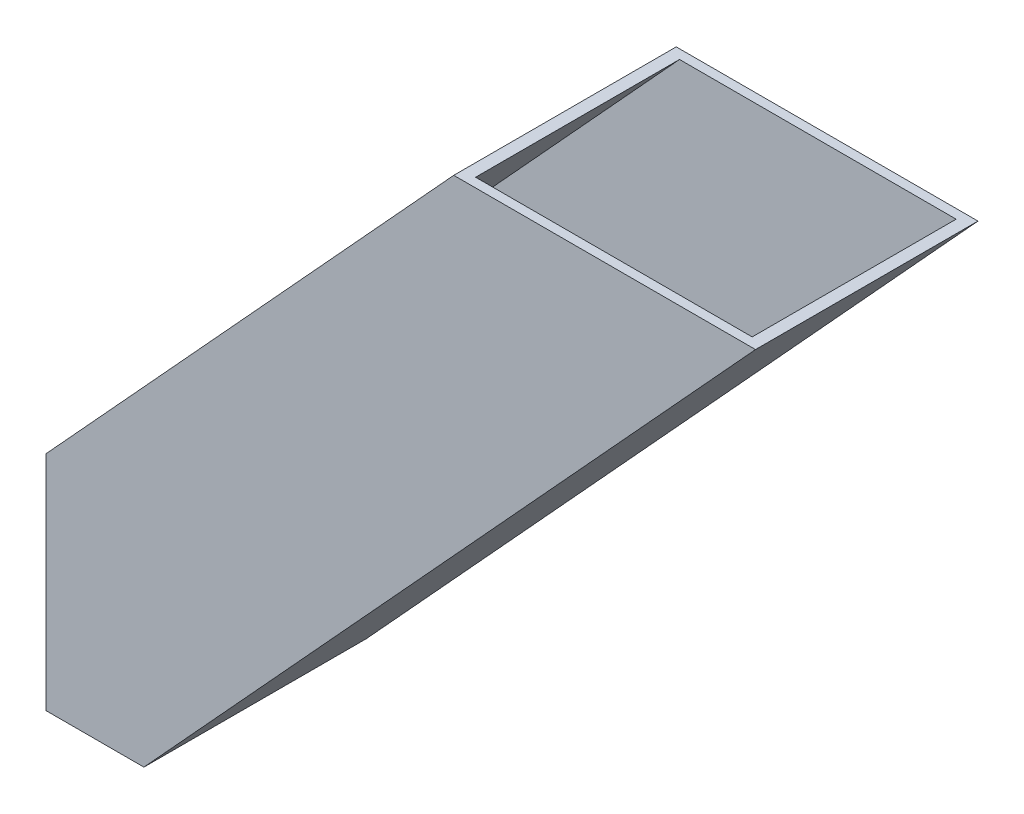
ISO-10303-21;
HEADER;
FILE_DESCRIPTION(('STEP AP214'),'2;1');
FILE_NAME('part.step','',(''),(''),'','','');
FILE_SCHEMA(('AUTOMOTIVE_DESIGN { 1 0 10303 214 1 1 1 1 }'));
ENDSEC;
DATA;
#1=APPLICATION_CONTEXT('core data for automotive mechanical design processes');
#2=APPLICATION_PROTOCOL_DEFINITION('international standard','automotive_design',2000,#1);
#3=PRODUCT_CONTEXT('',#1,'mechanical');
#4=PRODUCT('Part','Part','',(#3));
#5=PRODUCT_RELATED_PRODUCT_CATEGORY('part','',(#4));
#6=PRODUCT_DEFINITION_FORMATION('','',#4);
#7=PRODUCT_DEFINITION_CONTEXT('part definition',#1,'design');
#8=PRODUCT_DEFINITION('design','',#6,#7);
#9=PRODUCT_DEFINITION_SHAPE('','',#8);
#10=(LENGTH_UNIT() NAMED_UNIT(*) SI_UNIT(.MILLI.,.METRE.));
#11=(NAMED_UNIT(*) PLANE_ANGLE_UNIT() SI_UNIT($,.RADIAN.));
#12=(NAMED_UNIT(*) SI_UNIT($,.STERADIAN.) SOLID_ANGLE_UNIT());
#13=UNCERTAINTY_MEASURE_WITH_UNIT(LENGTH_MEASURE(1.E-05),#10,'distance_accuracy_value','');
#14=(GEOMETRIC_REPRESENTATION_CONTEXT(3) GLOBAL_UNCERTAINTY_ASSIGNED_CONTEXT((#13)) GLOBAL_UNIT_ASSIGNED_CONTEXT((#10,
#11,#12)) REPRESENTATION_CONTEXT('',''));
#15=CARTESIAN_POINT('',(0.,0.,0.));
#16=DIRECTION('',(0.,0.,1.));
#17=DIRECTION('',(1.,0.,0.));
#18=AXIS2_PLACEMENT_3D('',#15,#16,#17);
#19=CARTESIAN_POINT('',(0.,0.,38.1));
#20=DIRECTION('',(0.,0.,1.));
#21=DIRECTION('',(1.,0.,0.));
#22=AXIS2_PLACEMENT_3D('',#19,#20,#21);
#23=PLANE('',#22);
#24=DIRECTION('',(0.,1.,0.));
#25=VECTOR('',#24,1.);
#26=CARTESIAN_POINT('',(-93.4095887439773,0.,38.1));
#27=LINE('',#26,#25);
#28=CARTESIAN_POINT('',(-93.4095887439773,-121.744349357766,38.1));
#29=VERTEX_POINT('',#28);
#30=CARTESIAN_POINT('',(-93.4095887439773,-45.5443493577662,38.1));
#31=VERTEX_POINT('',#30);
#32=EDGE_CURVE('E205',#29,#31,#27,.T.);
#33=ORIENTED_EDGE('',*,*,#32,.F.);
#34=DIRECTION('',(1.,0.,0.));
#35=VECTOR('',#34,1.);
#36=CARTESIAN_POINT('',(0.,-121.744349357766,38.1));
#37=LINE('',#36,#35);
#38=CARTESIAN_POINT('',(-59.8805305963749,-121.744349357766,38.1));
#39=VERTEX_POINT('',#38);
#40=EDGE_CURVE('E140',#29,#39,#37,.T.);
#41=ORIENTED_EDGE('',*,*,#40,.T.);
#42=DIRECTION('',(-0.675586062236673,-0.737281135328679,0.));
#43=VECTOR('',#42,1.);
#44=CARTESIAN_POINT('',(28.0904112560227,-25.7398289712173,38.1));
#45=LINE('',#44,#43);
#46=CARTESIAN_POINT('',(149.590411256023,106.855650642234,38.1));
#47=VERTEX_POINT('',#46);
#48=EDGE_CURVE('E167',#47,#39,#45,.T.);
#49=ORIENTED_EDGE('',*,*,#48,.F.);
#50=DIRECTION('',(-1.,0.,0.));
#51=VECTOR('',#50,1.);
#52=CARTESIAN_POINT('',(0.,106.855650642234,38.1));
#53=LINE('',#52,#51);
#54=CARTESIAN_POINT('',(46.2377058242878,106.855650642234,38.1));
#55=VERTEX_POINT('',#54);
#56=EDGE_CURVE('E156',#47,#55,#53,.T.);
#57=ORIENTED_EDGE('',*,*,#56,.T.);
#58=DIRECTION('',(0.675586062236673,0.737281135328679,0.));
#59=VECTOR('',#58,1.);
#60=CARTESIAN_POINT('',(-28.0904112560227,25.7398289712172,38.1));
#61=LINE('',#60,#59);
#62=EDGE_CURVE('E155',#31,#55,#61,.T.);
#63=ORIENTED_EDGE('',*,*,#62,.F.);
#64=EDGE_LOOP('',(#33,#41,#49,#57,#63));
#65=FACE_BOUND('',#64,.T.);
#66=ADVANCED_FACE('F41',(#65),#23,.T.);
#67=CARTESIAN_POINT('',(0.,0.,-38.1));
#68=DIRECTION('',(0.,0.,1.));
#69=DIRECTION('',(1.,0.,0.));
#70=AXIS2_PLACEMENT_3D('',#67,#68,#69);
#71=PLANE('',#70);
#72=DIRECTION('',(1.,0.,0.));
#73=VECTOR('',#72,1.);
#74=CARTESIAN_POINT('',(0.,-121.744349357766,-38.1));
#75=LINE('',#74,#73);
#76=CARTESIAN_POINT('',(-93.4095887439773,-121.744349357766,-38.1));
#77=VERTEX_POINT('',#76);
#78=CARTESIAN_POINT('',(-59.8805305963749,-121.744349357766,-38.1));
#79=VERTEX_POINT('',#78);
#80=EDGE_CURVE('E116',#77,#79,#75,.T.);
#81=ORIENTED_EDGE('',*,*,#80,.F.);
#82=DIRECTION('',(0.,1.,0.));
#83=VECTOR('',#82,1.);
#84=CARTESIAN_POINT('',(-93.4095887439773,0.,-38.1));
#85=LINE('',#84,#83);
#86=CARTESIAN_POINT('',(-93.4095887439773,-45.5443493577662,-38.1));
#87=VERTEX_POINT('',#86);
#88=EDGE_CURVE('E134',#77,#87,#85,.T.);
#89=ORIENTED_EDGE('',*,*,#88,.T.);
#90=DIRECTION('',(0.675586062236673,0.737281135328679,0.));
#91=VECTOR('',#90,1.);
#92=CARTESIAN_POINT('',(-28.0904112560227,25.7398289712172,-38.1));
#93=LINE('',#92,#91);
#94=CARTESIAN_POINT('',(46.2377058242878,106.855650642234,-38.1));
#95=VERTEX_POINT('',#94);
#96=EDGE_CURVE('E142',#87,#95,#93,.T.);
#97=ORIENTED_EDGE('',*,*,#96,.T.);
#98=DIRECTION('',(-1.,0.,0.));
#99=VECTOR('',#98,1.);
#100=CARTESIAN_POINT('',(0.,106.855650642234,-38.1));
#101=LINE('',#100,#99);
#102=CARTESIAN_POINT('',(149.590411256023,106.855650642234,-38.1));
#103=VERTEX_POINT('',#102);
#104=EDGE_CURVE('E145',#103,#95,#101,.T.);
#105=ORIENTED_EDGE('',*,*,#104,.F.);
#106=DIRECTION('',(-0.675586062236673,-0.737281135328679,0.));
#107=VECTOR('',#106,1.);
#108=CARTESIAN_POINT('',(28.0904112560227,-25.7398289712173,-38.1));
#109=LINE('',#108,#107);
#110=EDGE_CURVE('E137',#103,#79,#109,.T.);
#111=ORIENTED_EDGE('',*,*,#110,.T.);
#112=EDGE_LOOP('',(#81,#89,#97,#105,#111));
#113=FACE_BOUND('',#112,.T.);
#114=ADVANCED_FACE('F128',(#113),#71,.F.);
#115=CARTESIAN_POINT('',(-93.4095887439773,0.,38.1));
#116=DIRECTION('',(-1.,0.,0.));
#117=DIRECTION('',(0.,0.,1.));
#118=AXIS2_PLACEMENT_3D('',#115,#116,#117);
#119=PLANE('',#118);
#120=ORIENTED_EDGE('',*,*,#88,.F.);
#121=DIRECTION('',(0.,0.,1.));
#122=VECTOR('',#121,1.);
#123=CARTESIAN_POINT('',(-93.4095887439773,-121.744349357766,-38.1));
#124=LINE('',#123,#122);
#125=CARTESIAN_POINT('',(-93.4095887439773,-121.744349357766,-34.925));
#126=VERTEX_POINT('',#125);
#127=EDGE_CURVE('E119',#77,#126,#124,.T.);
#128=ORIENTED_EDGE('',*,*,#127,.T.);
#129=DIRECTION('',(0.,1.,0.));
#130=VECTOR('',#129,1.);
#131=CARTESIAN_POINT('',(-93.4095887439773,0.,-34.925));
#132=LINE('',#131,#130);
#133=CARTESIAN_POINT('',(-93.4095887439773,-50.2439726588871,-34.925));
#134=VERTEX_POINT('',#133);
#135=EDGE_CURVE('E180',#126,#134,#132,.T.);
#136=ORIENTED_EDGE('',*,*,#135,.T.);
#137=DIRECTION('',(0.,0.,-1.));
#138=VECTOR('',#137,1.);
#139=CARTESIAN_POINT('',(-93.4095887439773,-50.2439726588871,38.1));
#140=LINE('',#139,#138);
#141=CARTESIAN_POINT('',(-93.4095887439773,-50.2439726588871,34.925));
#142=VERTEX_POINT('',#141);
#143=EDGE_CURVE('E148',#142,#134,#140,.T.);
#144=ORIENTED_EDGE('',*,*,#143,.F.);
#145=DIRECTION('',(0.,1.,0.));
#146=VECTOR('',#145,1.);
#147=CARTESIAN_POINT('',(-93.4095887439773,0.,34.925));
#148=LINE('',#147,#146);
#149=CARTESIAN_POINT('',(-93.4095887439773,-121.744349357766,34.925));
#150=VERTEX_POINT('',#149);
#151=EDGE_CURVE('E62',#150,#142,#148,.T.);
#152=ORIENTED_EDGE('',*,*,#151,.F.);
#153=EDGE_CURVE('E127',#150,#29,#124,.T.);
#154=ORIENTED_EDGE('',*,*,#153,.T.);
#155=ORIENTED_EDGE('',*,*,#32,.T.);
#156=DIRECTION('',(0.,0.,-1.));
#157=VECTOR('',#156,1.);
#158=CARTESIAN_POINT('',(-93.4095887439773,-45.5443493577662,38.1));
#159=LINE('',#158,#157);
#160=EDGE_CURVE('E47',#31,#87,#159,.T.);
#161=ORIENTED_EDGE('',*,*,#160,.T.);
#162=EDGE_LOOP('',(#120,#128,#136,#144,#152,#154,#155,#161));
#163=FACE_BOUND('',#162,.T.);
#164=ADVANCED_FACE('F136',(#163),#119,.T.);
#165=CARTESIAN_POINT('',(25.7495436513542,-23.5948432236158,38.1));
#166=DIRECTION('',(0.737281135328679,-0.675586062236673,0.));
#167=DIRECTION('',(0.675586062236673,0.737281135328679,0.));
#168=AXIS2_PLACEMENT_3D('',#165,#166,#167);
#169=PLANE('',#168);
#170=DIRECTION('',(0.,0.,-1.));
#171=VECTOR('',#170,1.);
#172=CARTESIAN_POINT('',(-64.1868933226972,-121.744349357766,38.1));
#173=LINE('',#172,#171);
#174=CARTESIAN_POINT('',(-64.1868933226972,-121.744349357766,34.925));
#175=VERTEX_POINT('',#174);
#176=CARTESIAN_POINT('',(-64.1868933226972,-121.744349357766,-34.925));
#177=VERTEX_POINT('',#176);
#178=EDGE_CURVE('E57',#175,#177,#173,.T.);
#179=ORIENTED_EDGE('',*,*,#178,.F.);
#180=DIRECTION('',(-0.675586062236673,-0.737281135328679,0.));
#181=VECTOR('',#180,1.);
#182=CARTESIAN_POINT('',(25.7495436513542,-23.5948432236158,34.925));
#183=LINE('',#182,#181);
#184=CARTESIAN_POINT('',(145.2840485297,106.855650642234,34.925));
#185=VERTEX_POINT('',#184);
#186=EDGE_CURVE('E182',#185,#175,#183,.T.);
#187=ORIENTED_EDGE('',*,*,#186,.F.);
#188=DIRECTION('',(0.,0.,-1.));
#189=VECTOR('',#188,1.);
#190=CARTESIAN_POINT('',(145.2840485297,106.855650642234,38.1));
#191=LINE('',#190,#189);
#192=CARTESIAN_POINT('',(145.2840485297,106.855650642234,-34.925));
#193=VERTEX_POINT('',#192);
#194=EDGE_CURVE('E186',#185,#193,#191,.T.);
#195=ORIENTED_EDGE('',*,*,#194,.T.);
#196=DIRECTION('',(-0.675586062236673,-0.737281135328679,0.));
#197=VECTOR('',#196,1.);
#198=CARTESIAN_POINT('',(25.7495436513542,-23.5948432236158,-34.925));
#199=LINE('',#198,#197);
#200=EDGE_CURVE('E183',#193,#177,#199,.T.);
#201=ORIENTED_EDGE('',*,*,#200,.T.);
#202=EDGE_LOOP('',(#179,#187,#195,#201));
#203=FACE_BOUND('',#202,.T.);
#204=ADVANCED_FACE('F229',(#203),#169,.F.);
#205=CARTESIAN_POINT('',(0.,0.,34.925));
#206=DIRECTION('',(0.,0.,1.));
#207=DIRECTION('',(1.,0.,0.));
#208=AXIS2_PLACEMENT_3D('',#205,#206,#207);
#209=PLANE('',#208);
#210=DIRECTION('',(1.,0.,0.));
#211=VECTOR('',#210,1.);
#212=CARTESIAN_POINT('',(0.,-121.744349357766,34.925));
#213=LINE('',#212,#211);
#214=EDGE_CURVE('E166',#150,#175,#213,.T.);
#215=ORIENTED_EDGE('',*,*,#214,.F.);
#216=ORIENTED_EDGE('',*,*,#151,.T.);
#217=DIRECTION('',(0.675586062236673,0.737281135328679,0.));
#218=VECTOR('',#217,1.);
#219=CARTESIAN_POINT('',(-25.7495436513541,23.5948432236158,34.925));
#220=LINE('',#219,#218);
#221=CARTESIAN_POINT('',(50.5440685506101,106.855650642234,34.925));
#222=VERTEX_POINT('',#221);
#223=EDGE_CURVE('E179',#142,#222,#220,.T.);
#224=ORIENTED_EDGE('',*,*,#223,.T.);
#225=DIRECTION('',(-1.,0.,0.));
#226=VECTOR('',#225,1.);
#227=CARTESIAN_POINT('',(0.,106.855650642234,34.925));
#228=LINE('',#227,#226);
#229=EDGE_CURVE('E184',#185,#222,#228,.T.);
#230=ORIENTED_EDGE('',*,*,#229,.F.);
#231=ORIENTED_EDGE('',*,*,#186,.T.);
#232=EDGE_LOOP('',(#215,#216,#224,#230,#231));
#233=FACE_BOUND('',#232,.T.);
#234=ADVANCED_FACE('F232',(#233),#209,.F.);
#235=CARTESIAN_POINT('',(0.,0.,-34.925));
#236=DIRECTION('',(0.,0.,1.));
#237=DIRECTION('',(1.,0.,0.));
#238=AXIS2_PLACEMENT_3D('',#235,#236,#237);
#239=PLANE('',#238);
#240=ORIENTED_EDGE('',*,*,#135,.F.);
#241=DIRECTION('',(1.,0.,0.));
#242=VECTOR('',#241,1.);
#243=CARTESIAN_POINT('',(0.,-121.744349357766,-34.925));
#244=LINE('',#243,#242);
#245=EDGE_CURVE('E11',#126,#177,#244,.T.);
#246=ORIENTED_EDGE('',*,*,#245,.T.);
#247=ORIENTED_EDGE('',*,*,#200,.F.);
#248=DIRECTION('',(-1.,0.,0.));
#249=VECTOR('',#248,1.);
#250=CARTESIAN_POINT('',(0.,106.855650642234,-34.925));
#251=LINE('',#250,#249);
#252=CARTESIAN_POINT('',(50.5440685506101,106.855650642234,-34.925));
#253=VERTEX_POINT('',#252);
#254=EDGE_CURVE('E178',#193,#253,#251,.T.);
#255=ORIENTED_EDGE('',*,*,#254,.T.);
#256=DIRECTION('',(0.675586062236673,0.737281135328679,0.));
#257=VECTOR('',#256,1.);
#258=CARTESIAN_POINT('',(-25.7495436513541,23.5948432236158,-34.925));
#259=LINE('',#258,#257);
#260=EDGE_CURVE('E175',#134,#253,#259,.T.);
#261=ORIENTED_EDGE('',*,*,#260,.F.);
#262=EDGE_LOOP('',(#240,#246,#247,#255,#261));
#263=FACE_BOUND('',#262,.T.);
#264=ADVANCED_FACE('F214',(#263),#239,.T.);
#265=CARTESIAN_POINT('',(0.,106.855650642234,38.1));
#266=DIRECTION('',(0.,-1.,0.));
#267=DIRECTION('',(0.,0.,-1.));
#268=AXIS2_PLACEMENT_3D('',#265,#266,#267);
#269=PLANE('',#268);
#270=ORIENTED_EDGE('',*,*,#104,.T.);
#271=DIRECTION('',(0.,0.,-1.));
#272=VECTOR('',#271,1.);
#273=CARTESIAN_POINT('',(46.2377058242878,106.855650642234,38.1));
#274=LINE('',#273,#272);
#275=EDGE_CURVE('E153',#55,#95,#274,.T.);
#276=ORIENTED_EDGE('',*,*,#275,.F.);
#277=ORIENTED_EDGE('',*,*,#56,.F.);
#278=DIRECTION('',(0.,0.,-1.));
#279=VECTOR('',#278,1.);
#280=CARTESIAN_POINT('',(149.590411256023,106.855650642234,38.1));
#281=LINE('',#280,#279);
#282=EDGE_CURVE('E154',#47,#103,#281,.T.);
#283=ORIENTED_EDGE('',*,*,#282,.T.);
#284=EDGE_LOOP('',(#270,#276,#277,#283));
#285=FACE_BOUND('',#284,.T.);
#286=ORIENTED_EDGE('',*,*,#254,.F.);
#287=ORIENTED_EDGE('',*,*,#194,.F.);
#288=ORIENTED_EDGE('',*,*,#229,.T.);
#289=DIRECTION('',(0.,0.,-1.));
#290=VECTOR('',#289,1.);
#291=CARTESIAN_POINT('',(50.5440685506101,106.855650642234,38.1));
#292=LINE('',#291,#290);
#293=EDGE_CURVE('E194',#222,#253,#292,.T.);
#294=ORIENTED_EDGE('',*,*,#293,.T.);
#295=EDGE_LOOP('',(#286,#287,#288,#294));
#296=FACE_BOUND('',#295,.T.);
#297=ADVANCED_FACE('F157',(#285,#296),#269,.F.);
#298=CARTESIAN_POINT('',(-28.0904112560227,25.7398289712172,38.1));
#299=DIRECTION('',(-0.737281135328679,0.675586062236673,0.));
#300=DIRECTION('',(-0.675586062236673,-0.737281135328679,0.));
#301=AXIS2_PLACEMENT_3D('',#298,#299,#300);
#302=PLANE('',#301);
#303=ORIENTED_EDGE('',*,*,#96,.F.);
#304=ORIENTED_EDGE('',*,*,#160,.F.);
#305=ORIENTED_EDGE('',*,*,#62,.T.);
#306=ORIENTED_EDGE('',*,*,#275,.T.);
#307=EDGE_LOOP('',(#303,#304,#305,#306));
#308=FACE_BOUND('',#307,.T.);
#309=ADVANCED_FACE('F43',(#308),#302,.T.);
#310=CARTESIAN_POINT('',(28.0904112560227,-25.7398289712173,38.1));
#311=DIRECTION('',(0.737281135328679,-0.675586062236673,0.));
#312=DIRECTION('',(0.675586062236673,0.737281135328679,0.));
#313=AXIS2_PLACEMENT_3D('',#310,#311,#312);
#314=PLANE('',#313);
#315=DIRECTION('',(0.,0.,1.));
#316=VECTOR('',#315,1.);
#317=CARTESIAN_POINT('',(-59.8805305963749,-121.744349357766,-38.1));
#318=LINE('',#317,#316);
#319=EDGE_CURVE('E123',#79,#39,#318,.T.);
#320=ORIENTED_EDGE('',*,*,#319,.F.);
#321=ORIENTED_EDGE('',*,*,#110,.F.);
#322=ORIENTED_EDGE('',*,*,#282,.F.);
#323=ORIENTED_EDGE('',*,*,#48,.T.);
#324=EDGE_LOOP('',(#320,#321,#322,#323));
#325=FACE_BOUND('',#324,.T.);
#326=ADVANCED_FACE('F164',(#325),#314,.T.);
#327=CARTESIAN_POINT('',(-25.7495436513541,23.5948432236158,38.1));
#328=DIRECTION('',(-0.737281135328679,0.675586062236673,0.));
#329=DIRECTION('',(-0.675586062236673,-0.737281135328679,0.));
#330=AXIS2_PLACEMENT_3D('',#327,#328,#329);
#331=PLANE('',#330);
#332=ORIENTED_EDGE('',*,*,#260,.T.);
#333=ORIENTED_EDGE('',*,*,#293,.F.);
#334=ORIENTED_EDGE('',*,*,#223,.F.);
#335=ORIENTED_EDGE('',*,*,#143,.T.);
#336=EDGE_LOOP('',(#332,#333,#334,#335));
#337=FACE_BOUND('',#336,.T.);
#338=ADVANCED_FACE('F213',(#337),#331,.F.);
#339=CARTESIAN_POINT('',(0.,-121.744349357766,-38.1));
#340=DIRECTION('',(0.,-1.,0.));
#341=DIRECTION('',(1.,0.,0.));
#342=AXIS2_PLACEMENT_3D('',#339,#340,#341);
#343=PLANE('',#342);
#344=ORIENTED_EDGE('',*,*,#214,.T.);
#345=ORIENTED_EDGE('',*,*,#178,.T.);
#346=ORIENTED_EDGE('',*,*,#245,.F.);
#347=ORIENTED_EDGE('',*,*,#127,.F.);
#348=ORIENTED_EDGE('',*,*,#80,.T.);
#349=ORIENTED_EDGE('',*,*,#319,.T.);
#350=ORIENTED_EDGE('',*,*,#40,.F.);
#351=ORIENTED_EDGE('',*,*,#153,.F.);
#352=EDGE_LOOP('',(#344,#345,#346,#347,#348,#349,#350,#351));
#353=FACE_BOUND('',#352,.T.);
#354=ADVANCED_FACE('F120',(#353),#343,.T.);
#355=CLOSED_SHELL('',(#66,#114,#164,#204,#234,#264,#297,#309,#326,#338,#354));
#356=MANIFOLD_SOLID_BREP('B2',#355);
#357=ADVANCED_BREP_SHAPE_REPRESENTATION('',(#18,#356),#14);
#358=SHAPE_DEFINITION_REPRESENTATION(#9,#357);
ENDSEC;
END-ISO-10303-21;
